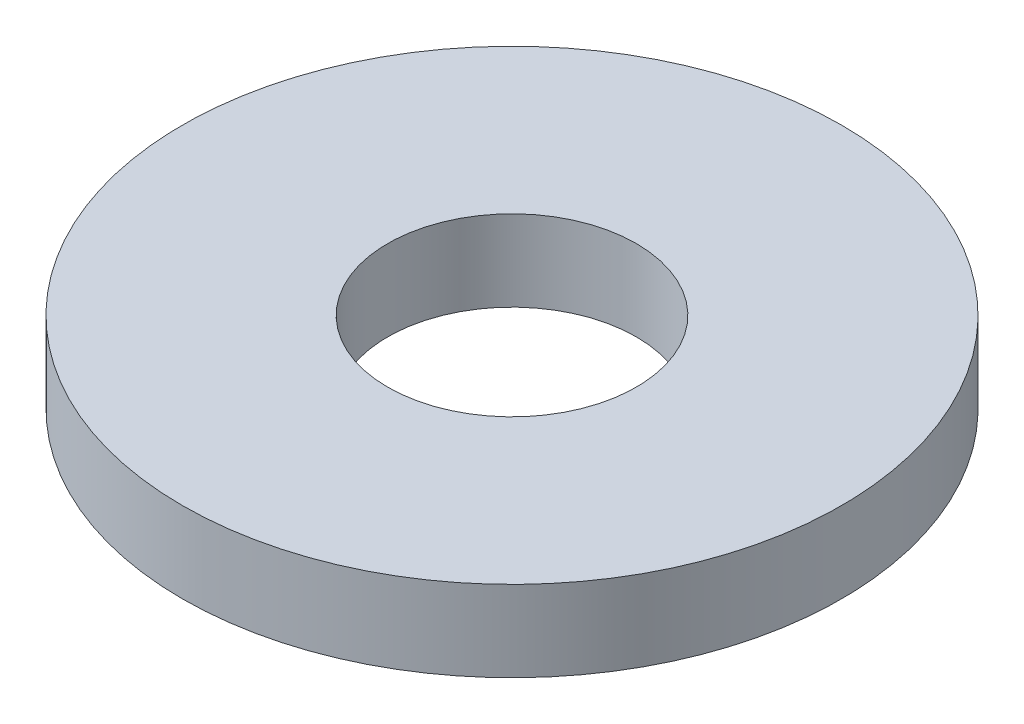
ISO-10303-21;
HEADER;
FILE_DESCRIPTION(('STEP AP214'),'2;1');
FILE_NAME('part.step','',(''),(''),'','','');
FILE_SCHEMA(('AUTOMOTIVE_DESIGN { 1 0 10303 214 1 1 1 1 }'));
ENDSEC;
DATA;
#1=APPLICATION_CONTEXT('core data for automotive mechanical design processes');
#2=APPLICATION_PROTOCOL_DEFINITION('international standard','automotive_design',2000,#1);
#3=PRODUCT_CONTEXT('',#1,'mechanical');
#4=PRODUCT('Part','Part','',(#3));
#5=PRODUCT_RELATED_PRODUCT_CATEGORY('part','',(#4));
#6=PRODUCT_DEFINITION_FORMATION('','',#4);
#7=PRODUCT_DEFINITION_CONTEXT('part definition',#1,'design');
#8=PRODUCT_DEFINITION('design','',#6,#7);
#9=PRODUCT_DEFINITION_SHAPE('','',#8);
#10=(LENGTH_UNIT() NAMED_UNIT(*) SI_UNIT(.MILLI.,.METRE.));
#11=(NAMED_UNIT(*) PLANE_ANGLE_UNIT() SI_UNIT($,.RADIAN.));
#12=(NAMED_UNIT(*) SI_UNIT($,.STERADIAN.) SOLID_ANGLE_UNIT());
#13=UNCERTAINTY_MEASURE_WITH_UNIT(LENGTH_MEASURE(1.E-05),#10,'distance_accuracy_value','');
#14=(GEOMETRIC_REPRESENTATION_CONTEXT(3) GLOBAL_UNCERTAINTY_ASSIGNED_CONTEXT((#13)) GLOBAL_UNIT_ASSIGNED_CONTEXT((#10,
#11,#12)) REPRESENTATION_CONTEXT('',''));
#15=CARTESIAN_POINT('',(0.,0.,0.));
#16=DIRECTION('',(0.,0.,1.));
#17=DIRECTION('',(1.,0.,0.));
#18=AXIS2_PLACEMENT_3D('',#15,#16,#17);
#19=CARTESIAN_POINT('',(0.,3.25,0.));
#20=DIRECTION('',(0.,1.,0.));
#21=DIRECTION('',(0.,0.,1.));
#22=AXIS2_PLACEMENT_3D('',#19,#20,#21);
#23=PLANE('',#22);
#24=CARTESIAN_POINT('',(0.,3.25,0.));
#25=DIRECTION('',(0.,1.,0.));
#26=DIRECTION('',(0.,0.,1.));
#27=AXIS2_PLACEMENT_3D('',#24,#25,#26);
#28=CIRCLE('',#27,13.25);
#29=CARTESIAN_POINT('',(0.,3.25,-13.25));
#30=VERTEX_POINT('',#29);
#31=EDGE_CURVE('E10',#30,#30,#28,.T.);
#32=ORIENTED_EDGE('',*,*,#31,.T.);
#33=EDGE_LOOP('',(#32));
#34=FACE_BOUND('',#33,.T.);
#35=CARTESIAN_POINT('',(0.,3.25,0.));
#36=DIRECTION('',(0.,1.,0.));
#37=DIRECTION('',(0.,0.,1.));
#38=AXIS2_PLACEMENT_3D('',#35,#36,#37);
#39=CIRCLE('',#38,5.);
#40=CARTESIAN_POINT('',(0.,3.25,-5.));
#41=VERTEX_POINT('',#40);
#42=EDGE_CURVE('E50',#41,#41,#39,.T.);
#43=ORIENTED_EDGE('',*,*,#42,.F.);
#44=EDGE_LOOP('',(#43));
#45=FACE_BOUND('',#44,.T.);
#46=ADVANCED_FACE('F39',(#34,#45),#23,.T.);
#47=CARTESIAN_POINT('',(0.,0.,0.));
#48=DIRECTION('',(0.,1.,0.));
#49=DIRECTION('',(0.,0.,1.));
#50=AXIS2_PLACEMENT_3D('',#47,#48,#49);
#51=PLANE('',#50);
#52=CARTESIAN_POINT('',(0.,0.,0.));
#53=DIRECTION('',(0.,1.,0.));
#54=DIRECTION('',(0.,0.,1.));
#55=AXIS2_PLACEMENT_3D('',#52,#53,#54);
#56=CIRCLE('',#55,13.25);
#57=CARTESIAN_POINT('',(0.,0.,-13.25));
#58=VERTEX_POINT('',#57);
#59=EDGE_CURVE('E43',#58,#58,#56,.T.);
#60=ORIENTED_EDGE('',*,*,#59,.F.);
#61=EDGE_LOOP('',(#60));
#62=FACE_BOUND('',#61,.T.);
#63=CARTESIAN_POINT('',(0.,0.,0.));
#64=DIRECTION('',(0.,1.,0.));
#65=DIRECTION('',(0.,0.,1.));
#66=AXIS2_PLACEMENT_3D('',#63,#64,#65);
#67=CIRCLE('',#66,5.);
#68=CARTESIAN_POINT('',(0.,0.,-5.));
#69=VERTEX_POINT('',#68);
#70=EDGE_CURVE('E52',#69,#69,#67,.T.);
#71=ORIENTED_EDGE('',*,*,#70,.T.);
#72=EDGE_LOOP('',(#71));
#73=FACE_BOUND('',#72,.T.);
#74=ADVANCED_FACE('F62',(#62,#73),#51,.F.);
#75=CARTESIAN_POINT('',(0.,3.25,0.));
#76=DIRECTION('',(0.,-1.,0.));
#77=DIRECTION('',(0.,0.,-1.));
#78=AXIS2_PLACEMENT_3D('',#75,#76,#77);
#79=CYLINDRICAL_SURFACE('',#78,13.25);
#80=CARTESIAN_POINT('',(0.,3.25,-13.25));
#81=CARTESIAN_POINT('',(0.,3.21614583333333,-13.25));
#82=CARTESIAN_POINT('',(0.,3.18229166666667,-13.25));
#83=CARTESIAN_POINT('',(0.,3.11458333333333,-13.25));
#84=CARTESIAN_POINT('',(0.,3.08072916666667,-13.25));
#85=CARTESIAN_POINT('',(0.,3.01302083333333,-13.25));
#86=CARTESIAN_POINT('',(0.,2.97916666666667,-13.25));
#87=CARTESIAN_POINT('',(0.,2.91145833333333,-13.25));
#88=CARTESIAN_POINT('',(0.,2.87760416666667,-13.25));
#89=CARTESIAN_POINT('',(0.,2.80989583333333,-13.25));
#90=CARTESIAN_POINT('',(0.,2.77604166666667,-13.25));
#91=CARTESIAN_POINT('',(0.,2.70833333333333,-13.25));
#92=CARTESIAN_POINT('',(0.,2.67447916666667,-13.25));
#93=CARTESIAN_POINT('',(0.,2.60677083333333,-13.25));
#94=CARTESIAN_POINT('',(0.,2.57291666666667,-13.25));
#95=CARTESIAN_POINT('',(0.,2.50520833333333,-13.25));
#96=CARTESIAN_POINT('',(0.,2.47135416666667,-13.25));
#97=CARTESIAN_POINT('',(0.,2.40364583333333,-13.25));
#98=CARTESIAN_POINT('',(0.,2.36979166666667,-13.25));
#99=CARTESIAN_POINT('',(0.,2.30208333333333,-13.25));
#100=CARTESIAN_POINT('',(0.,2.26822916666667,-13.25));
#101=CARTESIAN_POINT('',(0.,2.20052083333333,-13.25));
#102=CARTESIAN_POINT('',(0.,2.16666666666667,-13.25));
#103=CARTESIAN_POINT('',(0.,2.09895833333333,-13.25));
#104=CARTESIAN_POINT('',(0.,2.06510416666667,-13.25));
#105=CARTESIAN_POINT('',(0.,1.99739583333333,-13.25));
#106=CARTESIAN_POINT('',(0.,1.96354166666667,-13.25));
#107=CARTESIAN_POINT('',(0.,1.89583333333333,-13.25));
#108=CARTESIAN_POINT('',(0.,1.86197916666667,-13.25));
#109=CARTESIAN_POINT('',(0.,1.79427083333333,-13.25));
#110=CARTESIAN_POINT('',(0.,1.76041666666667,-13.25));
#111=CARTESIAN_POINT('',(0.,1.69270833333333,-13.25));
#112=CARTESIAN_POINT('',(0.,1.65885416666667,-13.25));
#113=CARTESIAN_POINT('',(0.,1.59114583333333,-13.25));
#114=CARTESIAN_POINT('',(0.,1.55729166666667,-13.25));
#115=CARTESIAN_POINT('',(0.,1.48958333333333,-13.25));
#116=CARTESIAN_POINT('',(0.,1.45572916666667,-13.25));
#117=CARTESIAN_POINT('',(0.,1.38802083333333,-13.25));
#118=CARTESIAN_POINT('',(0.,1.35416666666667,-13.25));
#119=CARTESIAN_POINT('',(0.,1.28645833333333,-13.25));
#120=CARTESIAN_POINT('',(0.,1.25260416666667,-13.25));
#121=CARTESIAN_POINT('',(0.,1.18489583333333,-13.25));
#122=CARTESIAN_POINT('',(0.,1.15104166666667,-13.25));
#123=CARTESIAN_POINT('',(0.,1.08333333333333,-13.25));
#124=CARTESIAN_POINT('',(0.,1.04947916666667,-13.25));
#125=CARTESIAN_POINT('',(0.,0.981770833333333,-13.25));
#126=CARTESIAN_POINT('',(0.,0.947916666666667,-13.25));
#127=CARTESIAN_POINT('',(0.,0.880208333333333,-13.25));
#128=CARTESIAN_POINT('',(0.,0.846354166666667,-13.25));
#129=CARTESIAN_POINT('',(0.,0.778645833333333,-13.25));
#130=CARTESIAN_POINT('',(0.,0.744791666666667,-13.25));
#131=CARTESIAN_POINT('',(0.,0.677083333333333,-13.25));
#132=CARTESIAN_POINT('',(0.,0.643229166666667,-13.25));
#133=CARTESIAN_POINT('',(0.,0.575520833333333,-13.25));
#134=CARTESIAN_POINT('',(0.,0.541666666666667,-13.25));
#135=CARTESIAN_POINT('',(0.,0.473958333333333,-13.25));
#136=CARTESIAN_POINT('',(0.,0.440104166666667,-13.25));
#137=CARTESIAN_POINT('',(0.,0.372395833333333,-13.25));
#138=CARTESIAN_POINT('',(0.,0.338541666666667,-13.25));
#139=CARTESIAN_POINT('',(0.,0.270833333333333,-13.25));
#140=CARTESIAN_POINT('',(0.,0.236979166666667,-13.25));
#141=CARTESIAN_POINT('',(0.,0.169270833333333,-13.25));
#142=CARTESIAN_POINT('',(0.,0.135416666666667,-13.25));
#143=CARTESIAN_POINT('',(0.,0.0677083333333334,-13.25));
#144=CARTESIAN_POINT('',(0.,0.0338541666666667,-13.25));
#145=CARTESIAN_POINT('',(0.,0.,-13.25));
#146=B_SPLINE_CURVE_WITH_KNOTS('',3,(#80,#81,#82,#83,#84,#85,#86,#87,#88,#89,#90,#91,#92,#93,
#94,#95,#96,#97,#98,#99,#100,#101,#102,#103,#104,#105,#106,#107,#108,#109,#110,#111,#112,#113,
#114,#115,#116,#117,#118,#119,#120,#121,#122,#123,#124,#125,#126,#127,#128,#129,#130,#131,#132,
#133,#134,#135,#136,#137,#138,#139,#140,#141,#142,#143,#144,#145),.UNSPECIFIED.,.F.,.F.,(4,2,2,
2,2,2,2,2,2,2,2,2,2,2,2,2,2,2,2,2,2,2,2,2,2,2,2,2,2,2,2,2,4),(0.,0.1015625,0.203125,0.3046875,
0.40625,0.5078125,0.609375,0.7109375,0.8125,0.9140625,1.015625,1.1171875,1.21875,1.3203125,
1.421875,1.5234375,1.625,1.7265625,1.828125,1.9296875,2.03125,2.1328125,2.234375,2.3359375,
2.4375,2.5390625,2.640625,2.7421875,2.84375,2.9453125,3.046875,3.1484375,3.25),.UNSPECIFIED.);
#147=EDGE_CURVE('BSEAM41',#30,#58,#146,.T.);
#148=ORIENTED_EDGE('',*,*,#31,.F.);
#149=ORIENTED_EDGE('',*,*,#59,.T.);
#150=ORIENTED_EDGE('',*,*,#147,.T.);
#151=ORIENTED_EDGE('',*,*,#147,.F.);
#152=EDGE_LOOP('',(#148,#150,#149,#151));
#153=FACE_BOUND('',#152,.T.);
#154=ADVANCED_FACE('F41',(#153),#79,.T.);
#155=CARTESIAN_POINT('',(0.,3.25,0.));
#156=DIRECTION('',(0.,-1.,0.));
#157=DIRECTION('',(0.,0.,-1.));
#158=AXIS2_PLACEMENT_3D('',#155,#156,#157);
#159=CYLINDRICAL_SURFACE('',#158,5.);
#160=CARTESIAN_POINT('',(0.,3.25,-5.));
#161=CARTESIAN_POINT('',(0.,3.21614583333333,-5.));
#162=CARTESIAN_POINT('',(0.,3.18229166666667,-5.));
#163=CARTESIAN_POINT('',(0.,3.11458333333333,-5.));
#164=CARTESIAN_POINT('',(0.,3.08072916666667,-5.));
#165=CARTESIAN_POINT('',(0.,3.01302083333333,-5.));
#166=CARTESIAN_POINT('',(0.,2.97916666666667,-5.));
#167=CARTESIAN_POINT('',(0.,2.91145833333333,-5.));
#168=CARTESIAN_POINT('',(0.,2.87760416666667,-5.));
#169=CARTESIAN_POINT('',(0.,2.80989583333333,-5.));
#170=CARTESIAN_POINT('',(0.,2.77604166666667,-5.));
#171=CARTESIAN_POINT('',(0.,2.70833333333333,-5.));
#172=CARTESIAN_POINT('',(0.,2.67447916666667,-5.));
#173=CARTESIAN_POINT('',(0.,2.60677083333333,-5.));
#174=CARTESIAN_POINT('',(0.,2.57291666666667,-5.));
#175=CARTESIAN_POINT('',(0.,2.50520833333333,-5.));
#176=CARTESIAN_POINT('',(0.,2.47135416666667,-5.));
#177=CARTESIAN_POINT('',(0.,2.40364583333333,-5.));
#178=CARTESIAN_POINT('',(0.,2.36979166666667,-5.));
#179=CARTESIAN_POINT('',(0.,2.30208333333333,-5.));
#180=CARTESIAN_POINT('',(0.,2.26822916666667,-5.));
#181=CARTESIAN_POINT('',(0.,2.20052083333333,-5.));
#182=CARTESIAN_POINT('',(0.,2.16666666666667,-5.));
#183=CARTESIAN_POINT('',(0.,2.09895833333333,-5.));
#184=CARTESIAN_POINT('',(0.,2.06510416666667,-5.));
#185=CARTESIAN_POINT('',(0.,1.99739583333333,-5.));
#186=CARTESIAN_POINT('',(0.,1.96354166666667,-5.));
#187=CARTESIAN_POINT('',(0.,1.89583333333333,-5.));
#188=CARTESIAN_POINT('',(0.,1.86197916666667,-5.));
#189=CARTESIAN_POINT('',(0.,1.79427083333333,-5.));
#190=CARTESIAN_POINT('',(0.,1.76041666666667,-5.));
#191=CARTESIAN_POINT('',(0.,1.69270833333333,-5.));
#192=CARTESIAN_POINT('',(0.,1.65885416666667,-5.));
#193=CARTESIAN_POINT('',(0.,1.59114583333333,-5.));
#194=CARTESIAN_POINT('',(0.,1.55729166666667,-5.));
#195=CARTESIAN_POINT('',(0.,1.48958333333333,-5.));
#196=CARTESIAN_POINT('',(0.,1.45572916666667,-5.));
#197=CARTESIAN_POINT('',(0.,1.38802083333333,-5.));
#198=CARTESIAN_POINT('',(0.,1.35416666666667,-5.));
#199=CARTESIAN_POINT('',(0.,1.28645833333333,-5.));
#200=CARTESIAN_POINT('',(0.,1.25260416666667,-5.));
#201=CARTESIAN_POINT('',(0.,1.18489583333333,-5.));
#202=CARTESIAN_POINT('',(0.,1.15104166666667,-5.));
#203=CARTESIAN_POINT('',(0.,1.08333333333333,-5.));
#204=CARTESIAN_POINT('',(0.,1.04947916666667,-5.));
#205=CARTESIAN_POINT('',(0.,0.981770833333333,-5.));
#206=CARTESIAN_POINT('',(0.,0.947916666666667,-5.));
#207=CARTESIAN_POINT('',(0.,0.880208333333333,-5.));
#208=CARTESIAN_POINT('',(0.,0.846354166666667,-5.));
#209=CARTESIAN_POINT('',(0.,0.778645833333333,-5.));
#210=CARTESIAN_POINT('',(0.,0.744791666666667,-5.));
#211=CARTESIAN_POINT('',(0.,0.677083333333333,-5.));
#212=CARTESIAN_POINT('',(0.,0.643229166666667,-5.));
#213=CARTESIAN_POINT('',(0.,0.575520833333333,-5.));
#214=CARTESIAN_POINT('',(0.,0.541666666666667,-5.));
#215=CARTESIAN_POINT('',(0.,0.473958333333333,-5.));
#216=CARTESIAN_POINT('',(0.,0.440104166666667,-5.));
#217=CARTESIAN_POINT('',(0.,0.372395833333333,-5.));
#218=CARTESIAN_POINT('',(0.,0.338541666666667,-5.));
#219=CARTESIAN_POINT('',(0.,0.270833333333333,-5.));
#220=CARTESIAN_POINT('',(0.,0.236979166666667,-5.));
#221=CARTESIAN_POINT('',(0.,0.169270833333333,-5.));
#222=CARTESIAN_POINT('',(0.,0.135416666666667,-5.));
#223=CARTESIAN_POINT('',(0.,0.0677083333333334,-5.));
#224=CARTESIAN_POINT('',(0.,0.0338541666666667,-5.));
#225=CARTESIAN_POINT('',(0.,0.,-5.));
#226=B_SPLINE_CURVE_WITH_KNOTS('',3,(#160,#161,#162,#163,#164,#165,#166,#167,#168,#169,#170,
#171,#172,#173,#174,#175,#176,#177,#178,#179,#180,#181,#182,#183,#184,#185,#186,#187,#188,#189,
#190,#191,#192,#193,#194,#195,#196,#197,#198,#199,#200,#201,#202,#203,#204,#205,#206,#207,#208,
#209,#210,#211,#212,#213,#214,#215,#216,#217,#218,#219,#220,#221,#222,#223,#224,#225),
.UNSPECIFIED.,.F.,.F.,(4,2,2,2,2,2,2,2,2,2,2,2,2,2,2,2,2,2,2,2,2,2,2,2,2,2,2,2,2,2,2,2,4),(0.,
0.1015625,0.203125,0.3046875,0.40625,0.5078125,0.609375,0.7109375,0.8125,0.9140625,1.015625,
1.1171875,1.21875,1.3203125,1.421875,1.5234375,1.625,1.7265625,1.828125,1.9296875,2.03125,
2.1328125,2.234375,2.3359375,2.4375,2.5390625,2.640625,2.7421875,2.84375,2.9453125,3.046875,
3.1484375,3.25),.UNSPECIFIED.);
#227=EDGE_CURVE('BSEAM58',#41,#69,#226,.T.);
#228=ORIENTED_EDGE('',*,*,#42,.T.);
#229=ORIENTED_EDGE('',*,*,#70,.F.);
#230=ORIENTED_EDGE('',*,*,#227,.T.);
#231=ORIENTED_EDGE('',*,*,#227,.F.);
#232=EDGE_LOOP('',(#228,#230,#229,#231));
#233=FACE_BOUND('',#232,.T.);
#234=ADVANCED_FACE('F58',(#233),#159,.F.);
#235=CLOSED_SHELL('',(#46,#74,#154,#234));
#236=MANIFOLD_SOLID_BREP('B2',#235);
#237=ADVANCED_BREP_SHAPE_REPRESENTATION('',(#18,#236),#14);
#238=SHAPE_DEFINITION_REPRESENTATION(#9,#237);
ENDSEC;
END-ISO-10303-21;
